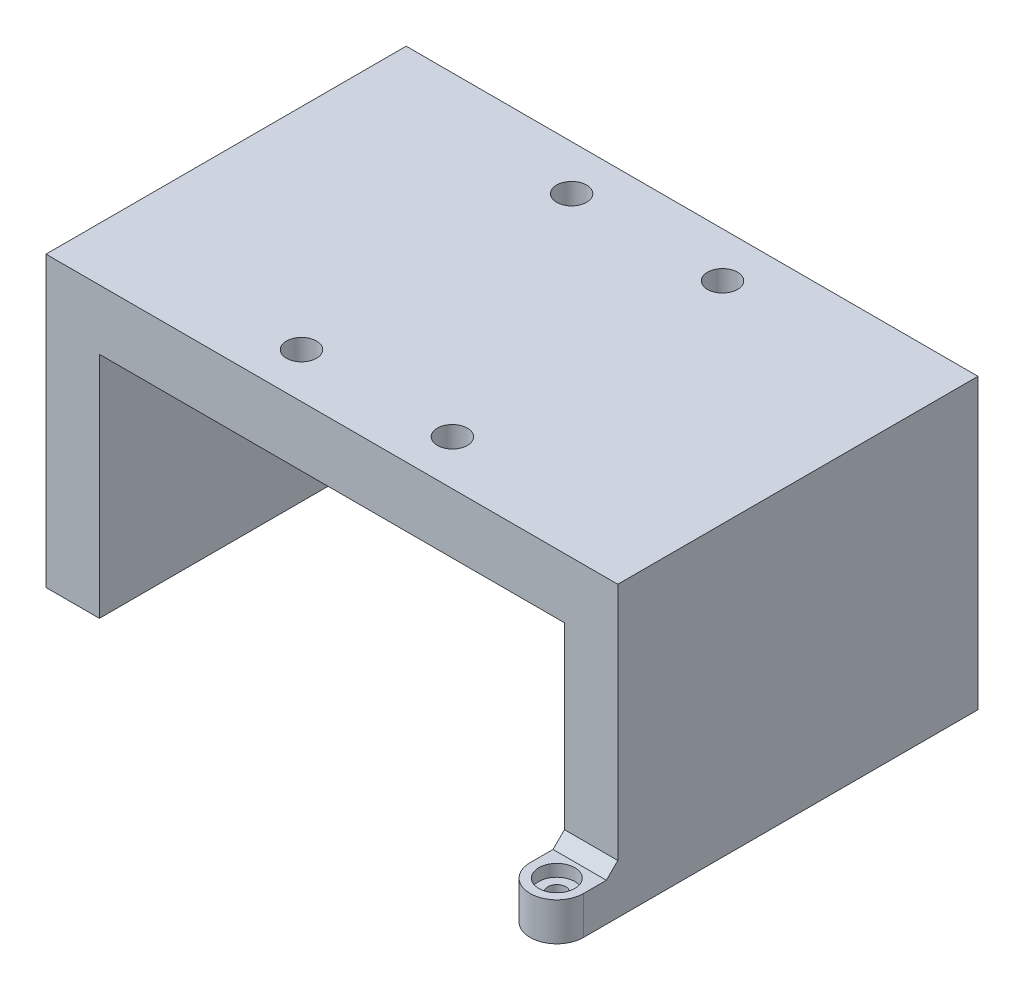
ISO-10303-21;
HEADER;
FILE_DESCRIPTION(('STEP AP214'),'2;1');
FILE_NAME('part.step','',(''),(''),'','','');
FILE_SCHEMA(('AUTOMOTIVE_DESIGN { 1 0 10303 214 1 1 1 1 }'));
ENDSEC;
DATA;
#1=APPLICATION_CONTEXT('core data for automotive mechanical design processes');
#2=APPLICATION_PROTOCOL_DEFINITION('international standard','automotive_design',2000,#1);
#3=PRODUCT_CONTEXT('',#1,'mechanical');
#4=PRODUCT('Part','Part','',(#3));
#5=PRODUCT_RELATED_PRODUCT_CATEGORY('part','',(#4));
#6=PRODUCT_DEFINITION_FORMATION('','',#4);
#7=PRODUCT_DEFINITION_CONTEXT('part definition',#1,'design');
#8=PRODUCT_DEFINITION('design','',#6,#7);
#9=PRODUCT_DEFINITION_SHAPE('','',#8);
#10=(LENGTH_UNIT() NAMED_UNIT(*) SI_UNIT(.MILLI.,.METRE.));
#11=(NAMED_UNIT(*) PLANE_ANGLE_UNIT() SI_UNIT($,.RADIAN.));
#12=(NAMED_UNIT(*) SI_UNIT($,.STERADIAN.) SOLID_ANGLE_UNIT());
#13=UNCERTAINTY_MEASURE_WITH_UNIT(LENGTH_MEASURE(1.E-05),#10,'distance_accuracy_value','');
#14=(GEOMETRIC_REPRESENTATION_CONTEXT(3) GLOBAL_UNCERTAINTY_ASSIGNED_CONTEXT((#13)) GLOBAL_UNIT_ASSIGNED_CONTEXT((#10,
#11,#12)) REPRESENTATION_CONTEXT('',''));
#15=CARTESIAN_POINT('',(0.,0.,0.));
#16=DIRECTION('',(0.,0.,1.));
#17=DIRECTION('',(1.,0.,0.));
#18=AXIS2_PLACEMENT_3D('',#15,#16,#17);
#19=CARTESIAN_POINT('',(-53.34,-31.75,0.));
#20=DIRECTION('',(0.,-1.,0.));
#21=DIRECTION('',(0.,0.,-1.));
#22=AXIS2_PLACEMENT_3D('',#19,#20,#21);
#23=CYLINDRICAL_SURFACE('',#22,1.5);
#24=CARTESIAN_POINT('',(-53.34,-38.1,0.));
#25=DIRECTION('',(0.,-1.,0.));
#26=DIRECTION('',(0.,0.,-1.));
#27=AXIS2_PLACEMENT_3D('',#24,#25,#26);
#28=CIRCLE('',#27,1.5);
#29=CARTESIAN_POINT('',(-53.34,-38.1,-1.50000000000002));
#30=VERTEX_POINT('',#29);
#31=EDGE_CURVE('E185',#30,#30,#28,.T.);
#32=ORIENTED_EDGE('',*,*,#31,.T.);
#33=EDGE_LOOP('',(#32));
#34=FACE_BOUND('',#33,.T.);
#35=CARTESIAN_POINT('',(-53.34,-33.74898,0.));
#36=DIRECTION('',(0.,1.,0.));
#37=DIRECTION('',(0.,0.,1.));
#38=AXIS2_PLACEMENT_3D('',#35,#36,#37);
#39=CIRCLE('',#38,1.5);
#40=CARTESIAN_POINT('',(-53.34,-33.74898,1.49999999999999));
#41=VERTEX_POINT('',#40);
#42=EDGE_CURVE('E175',#41,#41,#39,.F.);
#43=ORIENTED_EDGE('',*,*,#42,.F.);
#44=EDGE_LOOP('',(#43));
#45=FACE_BOUND('',#44,.T.);
#46=ADVANCED_FACE('F41',(#34,#45),#23,.F.);
#47=CARTESIAN_POINT('',(43.18,-31.75,35.715));
#48=DIRECTION('',(0.,-1.,0.));
#49=DIRECTION('',(0.,0.,-1.));
#50=AXIS2_PLACEMENT_3D('',#47,#48,#49);
#51=CYLINDRICAL_SURFACE('',#50,1.500000048);
#52=CARTESIAN_POINT('',(43.18,-38.1,35.715));
#53=DIRECTION('',(0.,-1.,0.));
#54=DIRECTION('',(0.,0.,-1.));
#55=AXIS2_PLACEMENT_3D('',#52,#53,#54);
#56=CIRCLE('',#55,1.500000048);
#57=CARTESIAN_POINT('',(43.18,-38.1,34.214999952));
#58=VERTEX_POINT('',#57);
#59=EDGE_CURVE('E181',#58,#58,#56,.T.);
#60=ORIENTED_EDGE('',*,*,#59,.T.);
#61=EDGE_LOOP('',(#60));
#62=FACE_BOUND('',#61,.T.);
#63=CARTESIAN_POINT('',(43.18,-33.74898,35.715));
#64=DIRECTION('',(0.,1.,0.));
#65=DIRECTION('',(0.,0.,1.));
#66=AXIS2_PLACEMENT_3D('',#63,#64,#65);
#67=CIRCLE('',#66,1.500000048);
#68=CARTESIAN_POINT('',(43.18,-33.74898,37.215000048));
#69=VERTEX_POINT('',#68);
#70=EDGE_CURVE('E296',#69,#69,#67,.F.);
#71=ORIENTED_EDGE('',*,*,#70,.F.);
#72=EDGE_LOOP('',(#71));
#73=FACE_BOUND('',#72,.T.);
#74=ADVANCED_FACE('F404',(#62,#73),#51,.F.);
#75=CARTESIAN_POINT('',(-47.625,9.99998,30.));
#76=DIRECTION('',(1.,0.,0.));
#77=DIRECTION('',(0.,0.,-1.));
#78=AXIS2_PLACEMENT_3D('',#75,#76,#77);
#79=PLANE('',#78);
#80=DIRECTION('',(0.,0.,1.));
#81=VECTOR('',#80,1.);
#82=CARTESIAN_POINT('',(-47.625,-29.845,30.));
#83=LINE('',#82,#81);
#84=CARTESIAN_POINT('',(-47.625,-29.845,-4.44500000000001));
#85=VERTEX_POINT('',#84);
#86=CARTESIAN_POINT('',(-47.625,-29.845,4.44499999999999));
#87=VERTEX_POINT('',#86);
#88=EDGE_CURVE('E295',#85,#87,#83,.T.);
#89=ORIENTED_EDGE('',*,*,#88,.T.);
#90=DIRECTION('',(0.,-1.,0.));
#91=VECTOR('',#90,1.);
#92=CARTESIAN_POINT('',(-47.625,-31.75,4.44499999999999));
#93=LINE('',#92,#91);
#94=CARTESIAN_POINT('',(-47.625,-38.1,4.44499999999999));
#95=VERTEX_POINT('',#94);
#96=EDGE_CURVE('E205',#87,#95,#93,.T.);
#97=ORIENTED_EDGE('',*,*,#96,.T.);
#98=DIRECTION('',(0.,0.,-1.));
#99=VECTOR('',#98,1.);
#100=CARTESIAN_POINT('',(-47.625,-38.1,30.));
#101=LINE('',#100,#99);
#102=CARTESIAN_POINT('',(-47.625,-38.1,30.));
#103=VERTEX_POINT('',#102);
#104=EDGE_CURVE('E229',#103,#95,#101,.T.);
#105=ORIENTED_EDGE('',*,*,#104,.F.);
#106=DIRECTION('',(0.,-1.,0.));
#107=VECTOR('',#106,1.);
#108=CARTESIAN_POINT('',(-47.625,9.99998,30.));
#109=LINE('',#108,#107);
#110=CARTESIAN_POINT('',(-47.625,9.99998,30.));
#111=VERTEX_POINT('',#110);
#112=EDGE_CURVE('E288',#111,#103,#109,.T.);
#113=ORIENTED_EDGE('',*,*,#112,.F.);
#114=DIRECTION('',(0.,0.,1.));
#115=VECTOR('',#114,1.);
#116=CARTESIAN_POINT('',(-47.625,9.99998,30.));
#117=LINE('',#116,#115);
#118=CARTESIAN_POINT('',(-47.625,9.99998,-30.));
#119=VERTEX_POINT('',#118);
#120=EDGE_CURVE('E279',#119,#111,#117,.T.);
#121=ORIENTED_EDGE('',*,*,#120,.F.);
#122=DIRECTION('',(0.,-1.,0.));
#123=VECTOR('',#122,1.);
#124=CARTESIAN_POINT('',(-47.625,9.99998,-30.));
#125=LINE('',#124,#123);
#126=CARTESIAN_POINT('',(-47.625,-38.1,-30.));
#127=VERTEX_POINT('',#126);
#128=EDGE_CURVE('E290',#119,#127,#125,.T.);
#129=ORIENTED_EDGE('',*,*,#128,.T.);
#130=CARTESIAN_POINT('',(-47.625,-38.1,-4.44500000000001));
#131=VERTEX_POINT('',#130);
#132=EDGE_CURVE('E233',#131,#127,#101,.T.);
#133=ORIENTED_EDGE('',*,*,#132,.F.);
#134=DIRECTION('',(0.,-1.,0.));
#135=VECTOR('',#134,1.);
#136=CARTESIAN_POINT('',(-47.625,-31.75,-4.44500000000001));
#137=LINE('',#136,#135);
#138=EDGE_CURVE('E213',#85,#131,#137,.T.);
#139=ORIENTED_EDGE('',*,*,#138,.F.);
#140=EDGE_LOOP('',(#89,#97,#105,#113,#121,#129,#133,#139));
#141=FACE_BOUND('',#140,.T.);
#142=ADVANCED_FACE('F325',(#141),#79,.F.);
#143=CARTESIAN_POINT('',(0.,0.,0.));
#144=DIRECTION('',(0.,-1.,0.));
#145=DIRECTION('',(0.,0.,-1.));
#146=AXIS2_PLACEMENT_3D('',#143,#144,#145);
#147=PLANE('',#146);
#148=CARTESIAN_POINT('',(12.57,0.,-22.5));
#149=DIRECTION('',(0.,1.,0.));
#150=DIRECTION('',(0.,0.,1.));
#151=AXIS2_PLACEMENT_3D('',#148,#149,#150);
#152=CIRCLE('',#151,2.5);
#153=CARTESIAN_POINT('',(12.57,0.,-20.));
#154=VERTEX_POINT('',#153);
#155=EDGE_CURVE('E252',#154,#154,#152,.T.);
#156=ORIENTED_EDGE('',*,*,#155,.T.);
#157=EDGE_LOOP('',(#156));
#158=FACE_BOUND('',#157,.T.);
#159=CARTESIAN_POINT('',(-12.57,0.,-22.5));
#160=DIRECTION('',(0.,1.,0.));
#161=DIRECTION('',(0.,0.,1.));
#162=AXIS2_PLACEMENT_3D('',#159,#160,#161);
#163=CIRCLE('',#162,2.5);
#164=CARTESIAN_POINT('',(-12.57,0.,-20.));
#165=VERTEX_POINT('',#164);
#166=EDGE_CURVE('E264',#165,#165,#163,.T.);
#167=ORIENTED_EDGE('',*,*,#166,.T.);
#168=EDGE_LOOP('',(#167));
#169=FACE_BOUND('',#168,.T.);
#170=CARTESIAN_POINT('',(12.57,0.,22.5));
#171=DIRECTION('',(0.,1.,0.));
#172=DIRECTION('',(0.,0.,1.));
#173=AXIS2_PLACEMENT_3D('',#170,#171,#172);
#174=CIRCLE('',#173,2.5);
#175=CARTESIAN_POINT('',(12.57,0.,25.));
#176=VERTEX_POINT('',#175);
#177=EDGE_CURVE('E258',#176,#176,#174,.T.);
#178=ORIENTED_EDGE('',*,*,#177,.T.);
#179=EDGE_LOOP('',(#178));
#180=FACE_BOUND('',#179,.T.);
#181=CARTESIAN_POINT('',(-12.57,0.,22.5));
#182=DIRECTION('',(0.,1.,0.));
#183=DIRECTION('',(0.,0.,1.));
#184=AXIS2_PLACEMENT_3D('',#181,#182,#183);
#185=CIRCLE('',#184,2.5);
#186=CARTESIAN_POINT('',(-12.57,0.,25.));
#187=VERTEX_POINT('',#186);
#188=EDGE_CURVE('E248',#187,#187,#185,.T.);
#189=ORIENTED_EDGE('',*,*,#188,.T.);
#190=EDGE_LOOP('',(#189));
#191=FACE_BOUND('',#190,.T.);
#192=DIRECTION('',(-1.,0.,0.));
#193=VECTOR('',#192,1.);
#194=CARTESIAN_POINT('',(-47.625,0.,-30.));
#195=LINE('',#194,#193);
#196=CARTESIAN_POINT('',(38.735,0.,-30.));
#197=VERTEX_POINT('',#196);
#198=CARTESIAN_POINT('',(-38.735,0.,-30.));
#199=VERTEX_POINT('',#198);
#200=EDGE_CURVE('E270',#197,#199,#195,.T.);
#201=ORIENTED_EDGE('',*,*,#200,.F.);
#202=DIRECTION('',(0.,0.,-1.));
#203=VECTOR('',#202,1.);
#204=CARTESIAN_POINT('',(38.735,0.,30.));
#205=LINE('',#204,#203);
#206=CARTESIAN_POINT('',(38.735,0.,30.));
#207=VERTEX_POINT('',#206);
#208=EDGE_CURVE('E224',#207,#197,#205,.T.);
#209=ORIENTED_EDGE('',*,*,#208,.F.);
#210=DIRECTION('',(1.,0.,0.));
#211=VECTOR('',#210,1.);
#212=CARTESIAN_POINT('',(-47.625,0.,30.));
#213=LINE('',#212,#211);
#214=CARTESIAN_POINT('',(-38.735,0.,30.));
#215=VERTEX_POINT('',#214);
#216=EDGE_CURVE('E277',#215,#207,#213,.T.);
#217=ORIENTED_EDGE('',*,*,#216,.F.);
#218=DIRECTION('',(0.,0.,1.));
#219=VECTOR('',#218,1.);
#220=CARTESIAN_POINT('',(-38.735,0.,30.));
#221=LINE('',#220,#219);
#222=EDGE_CURVE('E226',#199,#215,#221,.T.);
#223=ORIENTED_EDGE('',*,*,#222,.F.);
#224=EDGE_LOOP('',(#201,#209,#217,#223));
#225=FACE_BOUND('',#224,.T.);
#226=ADVANCED_FACE('F368',(#158,#169,#180,#191,#225),#147,.T.);
#227=CARTESIAN_POINT('',(0.,9.99998,0.));
#228=DIRECTION('',(0.,-1.,0.));
#229=DIRECTION('',(0.,0.,-1.));
#230=AXIS2_PLACEMENT_3D('',#227,#228,#229);
#231=PLANE('',#230);
#232=DIRECTION('',(0.,0.,-1.));
#233=VECTOR('',#232,1.);
#234=CARTESIAN_POINT('',(47.625,9.99998,30.));
#235=LINE('',#234,#233);
#236=CARTESIAN_POINT('',(47.625,9.99998,30.));
#237=VERTEX_POINT('',#236);
#238=CARTESIAN_POINT('',(47.625,9.99998,-30.));
#239=VERTEX_POINT('',#238);
#240=EDGE_CURVE('E273',#237,#239,#235,.T.);
#241=ORIENTED_EDGE('',*,*,#240,.T.);
#242=DIRECTION('',(-1.,0.,0.));
#243=VECTOR('',#242,1.);
#244=CARTESIAN_POINT('',(-47.625,9.99998,-30.));
#245=LINE('',#244,#243);
#246=EDGE_CURVE('E276',#239,#119,#245,.T.);
#247=ORIENTED_EDGE('',*,*,#246,.T.);
#248=ORIENTED_EDGE('',*,*,#120,.T.);
#249=DIRECTION('',(1.,0.,0.));
#250=VECTOR('',#249,1.);
#251=CARTESIAN_POINT('',(-47.625,9.99998,30.));
#252=LINE('',#251,#250);
#253=EDGE_CURVE('E281',#111,#237,#252,.T.);
#254=ORIENTED_EDGE('',*,*,#253,.T.);
#255=EDGE_LOOP('',(#241,#247,#248,#254));
#256=FACE_BOUND('',#255,.T.);
#257=CARTESIAN_POINT('',(-12.57,9.99998,-22.5));
#258=DIRECTION('',(0.,1.,0.));
#259=DIRECTION('',(0.,0.,1.));
#260=AXIS2_PLACEMENT_3D('',#257,#258,#259);
#261=CIRCLE('',#260,2.5);
#262=CARTESIAN_POINT('',(-12.57,9.99998,-20.));
#263=VERTEX_POINT('',#262);
#264=EDGE_CURVE('E267',#263,#263,#261,.T.);
#265=ORIENTED_EDGE('',*,*,#264,.F.);
#266=EDGE_LOOP('',(#265));
#267=FACE_BOUND('',#266,.T.);
#268=CARTESIAN_POINT('',(12.57,9.99998,22.5));
#269=DIRECTION('',(0.,1.,0.));
#270=DIRECTION('',(0.,0.,1.));
#271=AXIS2_PLACEMENT_3D('',#268,#269,#270);
#272=CIRCLE('',#271,2.5);
#273=CARTESIAN_POINT('',(12.57,9.99998,25.));
#274=VERTEX_POINT('',#273);
#275=EDGE_CURVE('E261',#274,#274,#272,.T.);
#276=ORIENTED_EDGE('',*,*,#275,.F.);
#277=EDGE_LOOP('',(#276));
#278=FACE_BOUND('',#277,.T.);
#279=CARTESIAN_POINT('',(12.57,9.99998,-22.5));
#280=DIRECTION('',(0.,1.,0.));
#281=DIRECTION('',(0.,0.,1.));
#282=AXIS2_PLACEMENT_3D('',#279,#280,#281);
#283=CIRCLE('',#282,2.5);
#284=CARTESIAN_POINT('',(12.57,9.99998,-20.));
#285=VERTEX_POINT('',#284);
#286=EDGE_CURVE('E255',#285,#285,#283,.T.);
#287=ORIENTED_EDGE('',*,*,#286,.F.);
#288=EDGE_LOOP('',(#287));
#289=FACE_BOUND('',#288,.T.);
#290=CARTESIAN_POINT('',(-12.57,9.99998,22.5));
#291=DIRECTION('',(0.,1.,0.));
#292=DIRECTION('',(0.,0.,1.));
#293=AXIS2_PLACEMENT_3D('',#290,#291,#292);
#294=CIRCLE('',#293,2.5);
#295=CARTESIAN_POINT('',(-12.57,9.99998,25.));
#296=VERTEX_POINT('',#295);
#297=EDGE_CURVE('E249',#296,#296,#294,.T.);
#298=ORIENTED_EDGE('',*,*,#297,.F.);
#299=EDGE_LOOP('',(#298));
#300=FACE_BOUND('',#299,.T.);
#301=ADVANCED_FACE('F354',(#256,#267,#278,#289,#300),#231,.F.);
#302=CARTESIAN_POINT('',(47.625,9.99998,30.));
#303=DIRECTION('',(-1.,0.,0.));
#304=DIRECTION('',(0.,0.,1.));
#305=AXIS2_PLACEMENT_3D('',#302,#303,#304);
#306=PLANE('',#305);
#307=DIRECTION('',(0.,-1.,0.));
#308=VECTOR('',#307,1.);
#309=CARTESIAN_POINT('',(47.625,9.99998,30.));
#310=LINE('',#309,#308);
#311=CARTESIAN_POINT('',(47.625,-29.845,30.));
#312=VERTEX_POINT('',#311);
#313=EDGE_CURVE('E283',#237,#312,#310,.T.);
#314=ORIENTED_EDGE('',*,*,#313,.T.);
#315=DIRECTION('',(0.,-0.70710678118655,0.707106781186545));
#316=VECTOR('',#315,1.);
#317=CARTESIAN_POINT('',(47.625,-9.92250999999987,10.07751));
#318=LINE('',#317,#316);
#319=CARTESIAN_POINT('',(47.625,-31.75,31.905));
#320=VERTEX_POINT('',#319);
#321=EDGE_CURVE('E50',#312,#320,#318,.T.);
#322=ORIENTED_EDGE('',*,*,#321,.T.);
#323=DIRECTION('',(0.,0.,1.));
#324=VECTOR('',#323,1.);
#325=CARTESIAN_POINT('',(47.625,-31.75,35.715));
#326=LINE('',#325,#324);
#327=CARTESIAN_POINT('',(47.625,-31.75,35.715));
#328=VERTEX_POINT('',#327);
#329=EDGE_CURVE('E182',#320,#328,#326,.T.);
#330=ORIENTED_EDGE('',*,*,#329,.T.);
#331=DIRECTION('',(0.,-1.,0.));
#332=VECTOR('',#331,1.);
#333=CARTESIAN_POINT('',(47.625,-31.75,35.715));
#334=LINE('',#333,#332);
#335=CARTESIAN_POINT('',(47.625,-38.1,35.715));
#336=VERTEX_POINT('',#335);
#337=EDGE_CURVE('E174',#328,#336,#334,.T.);
#338=ORIENTED_EDGE('',*,*,#337,.T.);
#339=DIRECTION('',(0.,0.,1.));
#340=VECTOR('',#339,1.);
#341=CARTESIAN_POINT('',(47.625,-38.1,30.));
#342=LINE('',#341,#340);
#343=CARTESIAN_POINT('',(47.625,-38.1,-30.));
#344=VERTEX_POINT('',#343);
#345=EDGE_CURVE('E164',#344,#336,#342,.T.);
#346=ORIENTED_EDGE('',*,*,#345,.F.);
#347=DIRECTION('',(0.,-1.,0.));
#348=VECTOR('',#347,1.);
#349=CARTESIAN_POINT('',(47.625,9.99998,-30.));
#350=LINE('',#349,#348);
#351=EDGE_CURVE('E293',#239,#344,#350,.T.);
#352=ORIENTED_EDGE('',*,*,#351,.F.);
#353=ORIENTED_EDGE('',*,*,#240,.F.);
#354=EDGE_LOOP('',(#314,#322,#330,#338,#346,#352,#353));
#355=FACE_BOUND('',#354,.T.);
#356=ADVANCED_FACE('F369',(#355),#306,.F.);
#357=CARTESIAN_POINT('',(-47.625,9.99998,-30.));
#358=DIRECTION('',(0.,0.,1.));
#359=DIRECTION('',(1.,0.,0.));
#360=AXIS2_PLACEMENT_3D('',#357,#358,#359);
#361=PLANE('',#360);
#362=ORIENTED_EDGE('',*,*,#351,.T.);
#363=DIRECTION('',(1.,0.,0.));
#364=VECTOR('',#363,1.);
#365=CARTESIAN_POINT('',(47.625,-38.1,-30.));
#366=LINE('',#365,#364);
#367=CARTESIAN_POINT('',(38.735,-38.1,-30.));
#368=VERTEX_POINT('',#367);
#369=EDGE_CURVE('E165',#368,#344,#366,.T.);
#370=ORIENTED_EDGE('',*,*,#369,.F.);
#371=DIRECTION('',(0.,1.,0.));
#372=VECTOR('',#371,1.);
#373=CARTESIAN_POINT('',(38.735,-38.1,-30.));
#374=LINE('',#373,#372);
#375=EDGE_CURVE('E159',#368,#197,#374,.T.);
#376=ORIENTED_EDGE('',*,*,#375,.T.);
#377=ORIENTED_EDGE('',*,*,#200,.T.);
#378=DIRECTION('',(0.,1.,0.));
#379=VECTOR('',#378,1.);
#380=CARTESIAN_POINT('',(-38.735,-38.1,-30.));
#381=LINE('',#380,#379);
#382=CARTESIAN_POINT('',(-38.735,-38.1,-30.));
#383=VERTEX_POINT('',#382);
#384=EDGE_CURVE('E245',#383,#199,#381,.T.);
#385=ORIENTED_EDGE('',*,*,#384,.F.);
#386=DIRECTION('',(1.,0.,0.));
#387=VECTOR('',#386,1.);
#388=CARTESIAN_POINT('',(-47.625,-38.1,-30.));
#389=LINE('',#388,#387);
#390=EDGE_CURVE('E232',#127,#383,#389,.T.);
#391=ORIENTED_EDGE('',*,*,#390,.F.);
#392=ORIENTED_EDGE('',*,*,#128,.F.);
#393=ORIENTED_EDGE('',*,*,#246,.F.);
#394=EDGE_LOOP('',(#362,#370,#376,#377,#385,#391,#392,#393));
#395=FACE_BOUND('',#394,.T.);
#396=ADVANCED_FACE('F358',(#395),#361,.F.);
#397=CARTESIAN_POINT('',(-47.625,9.99998,30.));
#398=DIRECTION('',(0.,0.,-1.));
#399=DIRECTION('',(-1.,0.,0.));
#400=AXIS2_PLACEMENT_3D('',#397,#398,#399);
#401=PLANE('',#400);
#402=DIRECTION('',(0.,1.,0.));
#403=VECTOR('',#402,1.);
#404=CARTESIAN_POINT('',(38.735,-38.1,30.));
#405=LINE('',#404,#403);
#406=CARTESIAN_POINT('',(38.735,-29.845,30.));
#407=VERTEX_POINT('',#406);
#408=EDGE_CURVE('E215',#407,#207,#405,.T.);
#409=ORIENTED_EDGE('',*,*,#408,.F.);
#410=DIRECTION('',(1.,0.,0.));
#411=VECTOR('',#410,1.);
#412=CARTESIAN_POINT('',(-47.625,-29.845,30.));
#413=LINE('',#412,#411);
#414=EDGE_CURVE('E306',#407,#312,#413,.T.);
#415=ORIENTED_EDGE('',*,*,#414,.T.);
#416=ORIENTED_EDGE('',*,*,#313,.F.);
#417=ORIENTED_EDGE('',*,*,#253,.F.);
#418=ORIENTED_EDGE('',*,*,#112,.T.);
#419=DIRECTION('',(-1.,0.,0.));
#420=VECTOR('',#419,1.);
#421=CARTESIAN_POINT('',(-47.625,-38.1,30.));
#422=LINE('',#421,#420);
#423=CARTESIAN_POINT('',(-38.735,-38.1,30.));
#424=VERTEX_POINT('',#423);
#425=EDGE_CURVE('E237',#424,#103,#422,.T.);
#426=ORIENTED_EDGE('',*,*,#425,.F.);
#427=DIRECTION('',(0.,1.,0.));
#428=VECTOR('',#427,1.);
#429=CARTESIAN_POINT('',(-38.735,-38.1,30.));
#430=LINE('',#429,#428);
#431=EDGE_CURVE('E240',#424,#215,#430,.T.);
#432=ORIENTED_EDGE('',*,*,#431,.T.);
#433=ORIENTED_EDGE('',*,*,#216,.T.);
#434=EDGE_LOOP('',(#409,#415,#416,#417,#418,#426,#432,#433));
#435=FACE_BOUND('',#434,.T.);
#436=ADVANCED_FACE('F351',(#435),#401,.F.);
#437=CARTESIAN_POINT('',(-12.57,9.99998,-22.5));
#438=DIRECTION('',(0.,-1.,0.));
#439=DIRECTION('',(0.,0.,-1.));
#440=AXIS2_PLACEMENT_3D('',#437,#438,#439);
#441=CYLINDRICAL_SURFACE('',#440,2.5);
#442=ORIENTED_EDGE('',*,*,#264,.T.);
#443=EDGE_LOOP('',(#442));
#444=FACE_BOUND('',#443,.T.);
#445=ORIENTED_EDGE('',*,*,#166,.F.);
#446=EDGE_LOOP('',(#445));
#447=FACE_BOUND('',#446,.T.);
#448=ADVANCED_FACE('F443',(#444,#447),#441,.F.);
#449=CARTESIAN_POINT('',(12.57,9.99998,22.5));
#450=DIRECTION('',(0.,-1.,0.));
#451=DIRECTION('',(0.,0.,-1.));
#452=AXIS2_PLACEMENT_3D('',#449,#450,#451);
#453=CYLINDRICAL_SURFACE('',#452,2.5);
#454=ORIENTED_EDGE('',*,*,#275,.T.);
#455=EDGE_LOOP('',(#454));
#456=FACE_BOUND('',#455,.T.);
#457=ORIENTED_EDGE('',*,*,#177,.F.);
#458=EDGE_LOOP('',(#457));
#459=FACE_BOUND('',#458,.T.);
#460=ADVANCED_FACE('F439',(#456,#459),#453,.F.);
#461=CARTESIAN_POINT('',(12.57,9.99998,-22.5));
#462=DIRECTION('',(0.,-1.,0.));
#463=DIRECTION('',(0.,0.,-1.));
#464=AXIS2_PLACEMENT_3D('',#461,#462,#463);
#465=CYLINDRICAL_SURFACE('',#464,2.5);
#466=ORIENTED_EDGE('',*,*,#286,.T.);
#467=EDGE_LOOP('',(#466));
#468=FACE_BOUND('',#467,.T.);
#469=ORIENTED_EDGE('',*,*,#155,.F.);
#470=EDGE_LOOP('',(#469));
#471=FACE_BOUND('',#470,.T.);
#472=ADVANCED_FACE('F435',(#468,#471),#465,.F.);
#473=CARTESIAN_POINT('',(-12.57,9.99998,22.5));
#474=DIRECTION('',(0.,-1.,0.));
#475=DIRECTION('',(0.,0.,-1.));
#476=AXIS2_PLACEMENT_3D('',#473,#474,#475);
#477=CYLINDRICAL_SURFACE('',#476,2.5);
#478=ORIENTED_EDGE('',*,*,#297,.T.);
#479=EDGE_LOOP('',(#478));
#480=FACE_BOUND('',#479,.T.);
#481=ORIENTED_EDGE('',*,*,#188,.F.);
#482=EDGE_LOOP('',(#481));
#483=FACE_BOUND('',#482,.T.);
#484=ADVANCED_FACE('F432',(#480,#483),#477,.F.);
#485=CARTESIAN_POINT('',(-38.735,-38.1,30.));
#486=DIRECTION('',(-1.,0.,0.));
#487=DIRECTION('',(0.,0.,1.));
#488=AXIS2_PLACEMENT_3D('',#485,#486,#487);
#489=PLANE('',#488);
#490=ORIENTED_EDGE('',*,*,#222,.T.);
#491=ORIENTED_EDGE('',*,*,#431,.F.);
#492=DIRECTION('',(0.,0.,1.));
#493=VECTOR('',#492,1.);
#494=CARTESIAN_POINT('',(-38.735,-38.1,30.));
#495=LINE('',#494,#493);
#496=EDGE_CURVE('E235',#383,#424,#495,.T.);
#497=ORIENTED_EDGE('',*,*,#496,.F.);
#498=ORIENTED_EDGE('',*,*,#384,.T.);
#499=EDGE_LOOP('',(#490,#491,#497,#498));
#500=FACE_BOUND('',#499,.T.);
#501=ADVANCED_FACE('F364',(#500),#489,.F.);
#502=CARTESIAN_POINT('',(0.,-38.1,0.));
#503=DIRECTION('',(0.,-1.,0.));
#504=DIRECTION('',(0.,0.,-1.));
#505=AXIS2_PLACEMENT_3D('',#502,#503,#504);
#506=PLANE('',#505);
#507=ORIENTED_EDGE('',*,*,#104,.T.);
#508=DIRECTION('',(-1.,0.,0.));
#509=VECTOR('',#508,1.);
#510=CARTESIAN_POINT('',(-53.34,-38.1,4.44499999999999));
#511=LINE('',#510,#509);
#512=CARTESIAN_POINT('',(-53.34,-38.1,4.44499999999999));
#513=VERTEX_POINT('',#512);
#514=EDGE_CURVE('E195',#95,#513,#511,.T.);
#515=ORIENTED_EDGE('',*,*,#514,.T.);
#516=CARTESIAN_POINT('',(-53.34,-38.1,0.));
#517=DIRECTION('',(0.,-1.,0.));
#518=DIRECTION('',(0.,0.,1.));
#519=AXIS2_PLACEMENT_3D('',#516,#517,#518);
#520=CIRCLE('',#519,4.445);
#521=CARTESIAN_POINT('',(-53.34,-38.1,-4.44500000000001));
#522=VERTEX_POINT('',#521);
#523=EDGE_CURVE('E208',#513,#522,#520,.T.);
#524=ORIENTED_EDGE('',*,*,#523,.T.);
#525=DIRECTION('',(1.,0.,0.));
#526=VECTOR('',#525,1.);
#527=CARTESIAN_POINT('',(-47.625,-38.1,-4.44500000000001));
#528=LINE('',#527,#526);
#529=EDGE_CURVE('E199',#522,#131,#528,.T.);
#530=ORIENTED_EDGE('',*,*,#529,.T.);
#531=ORIENTED_EDGE('',*,*,#132,.T.);
#532=ORIENTED_EDGE('',*,*,#390,.T.);
#533=ORIENTED_EDGE('',*,*,#496,.T.);
#534=ORIENTED_EDGE('',*,*,#425,.T.);
#535=EDGE_LOOP('',(#507,#515,#524,#530,#531,#532,#533,#534));
#536=FACE_BOUND('',#535,.T.);
#537=ORIENTED_EDGE('',*,*,#31,.F.);
#538=EDGE_LOOP('',(#537));
#539=FACE_BOUND('',#538,.T.);
#540=ADVANCED_FACE('F332',(#536,#539),#506,.T.);
#541=CARTESIAN_POINT('',(38.735,-38.1,30.));
#542=DIRECTION('',(1.,0.,0.));
#543=DIRECTION('',(0.,0.,-1.));
#544=AXIS2_PLACEMENT_3D('',#541,#542,#543);
#545=PLANE('',#544);
#546=ORIENTED_EDGE('',*,*,#208,.T.);
#547=ORIENTED_EDGE('',*,*,#375,.F.);
#548=DIRECTION('',(0.,0.,-1.));
#549=VECTOR('',#548,1.);
#550=CARTESIAN_POINT('',(38.735,-38.1,30.));
#551=LINE('',#550,#549);
#552=CARTESIAN_POINT('',(38.735,-38.1,35.715));
#553=VERTEX_POINT('',#552);
#554=EDGE_CURVE('E153',#553,#368,#551,.T.);
#555=ORIENTED_EDGE('',*,*,#554,.F.);
#556=DIRECTION('',(0.,-1.,0.));
#557=VECTOR('',#556,1.);
#558=CARTESIAN_POINT('',(38.735,-31.75,35.715));
#559=LINE('',#558,#557);
#560=CARTESIAN_POINT('',(38.735,-31.75,35.715));
#561=VERTEX_POINT('',#560);
#562=EDGE_CURVE('E156',#561,#553,#559,.T.);
#563=ORIENTED_EDGE('',*,*,#562,.F.);
#564=DIRECTION('',(0.,0.,-1.));
#565=VECTOR('',#564,1.);
#566=CARTESIAN_POINT('',(38.735,-31.75,30.));
#567=LINE('',#566,#565);
#568=CARTESIAN_POINT('',(38.735,-31.75,31.905));
#569=VERTEX_POINT('',#568);
#570=EDGE_CURVE('E190',#561,#569,#567,.T.);
#571=ORIENTED_EDGE('',*,*,#570,.T.);
#572=DIRECTION('',(0.,0.70710678118655,-0.707106781186545));
#573=VECTOR('',#572,1.);
#574=CARTESIAN_POINT('',(38.735,-33.9725,34.1275));
#575=LINE('',#574,#573);
#576=EDGE_CURVE('E11',#569,#407,#575,.T.);
#577=ORIENTED_EDGE('',*,*,#576,.T.);
#578=ORIENTED_EDGE('',*,*,#408,.T.);
#579=EDGE_LOOP('',(#546,#547,#555,#563,#571,#577,#578));
#580=FACE_BOUND('',#579,.T.);
#581=ADVANCED_FACE('F155',(#580),#545,.F.);
#582=CARTESIAN_POINT('',(0.,-38.1,0.));
#583=DIRECTION('',(0.,1.,0.));
#584=DIRECTION('',(0.,0.,1.));
#585=AXIS2_PLACEMENT_3D('',#582,#583,#584);
#586=PLANE('',#585);
#587=ORIENTED_EDGE('',*,*,#345,.T.);
#588=CARTESIAN_POINT('',(43.18,-38.1,35.715));
#589=DIRECTION('',(0.,-1.,0.));
#590=DIRECTION('',(0.,0.,1.));
#591=AXIS2_PLACEMENT_3D('',#588,#589,#590);
#592=CIRCLE('',#591,4.445);
#593=EDGE_CURVE('E171',#336,#553,#592,.T.);
#594=ORIENTED_EDGE('',*,*,#593,.T.);
#595=ORIENTED_EDGE('',*,*,#554,.T.);
#596=ORIENTED_EDGE('',*,*,#369,.T.);
#597=EDGE_LOOP('',(#587,#594,#595,#596));
#598=FACE_BOUND('',#597,.T.);
#599=ORIENTED_EDGE('',*,*,#59,.F.);
#600=EDGE_LOOP('',(#599));
#601=FACE_BOUND('',#600,.T.);
#602=ADVANCED_FACE('F177',(#598,#601),#586,.F.);
#603=CARTESIAN_POINT('',(-47.625,-31.75,-4.44500000000001));
#604=DIRECTION('',(0.,0.,-1.));
#605=DIRECTION('',(-1.,0.,0.));
#606=AXIS2_PLACEMENT_3D('',#603,#604,#605);
#607=PLANE('',#606);
#608=ORIENTED_EDGE('',*,*,#529,.F.);
#609=DIRECTION('',(0.,-1.,0.));
#610=VECTOR('',#609,1.);
#611=CARTESIAN_POINT('',(-53.34,-31.75,-4.44500000000001));
#612=LINE('',#611,#610);
#613=CARTESIAN_POINT('',(-53.34,-31.75,-4.44500000000001));
#614=VERTEX_POINT('',#613);
#615=EDGE_CURVE('E216',#614,#522,#612,.T.);
#616=ORIENTED_EDGE('',*,*,#615,.F.);
#617=DIRECTION('',(1.,0.,0.));
#618=VECTOR('',#617,1.);
#619=CARTESIAN_POINT('',(-47.625,-31.75,-4.44500000000001));
#620=LINE('',#619,#618);
#621=CARTESIAN_POINT('',(-49.53,-31.75,-4.44500000000001));
#622=VERTEX_POINT('',#621);
#623=EDGE_CURVE('E202',#614,#622,#620,.T.);
#624=ORIENTED_EDGE('',*,*,#623,.T.);
#625=DIRECTION('',(0.707106781186545,0.70710678118655,0.));
#626=VECTOR('',#625,1.);
#627=CARTESIAN_POINT('',(-47.625,-29.845,-4.44500000000001));
#628=LINE('',#627,#626);
#629=EDGE_CURVE('E312',#622,#85,#628,.T.);
#630=ORIENTED_EDGE('',*,*,#629,.T.);
#631=ORIENTED_EDGE('',*,*,#138,.T.);
#632=EDGE_LOOP('',(#608,#616,#624,#630,#631));
#633=FACE_BOUND('',#632,.T.);
#634=ADVANCED_FACE('F318',(#633),#607,.T.);
#635=CARTESIAN_POINT('',(-53.34,-31.75,0.));
#636=DIRECTION('',(0.,-1.,0.));
#637=DIRECTION('',(0.,0.,-1.));
#638=AXIS2_PLACEMENT_3D('',#635,#636,#637);
#639=CYLINDRICAL_SURFACE('',#638,4.445);
#640=ORIENTED_EDGE('',*,*,#523,.F.);
#641=DIRECTION('',(0.,-1.,0.));
#642=VECTOR('',#641,1.);
#643=CARTESIAN_POINT('',(-53.34,-31.75,4.44499999999999));
#644=LINE('',#643,#642);
#645=CARTESIAN_POINT('',(-53.34,-31.75,4.44499999999999));
#646=VERTEX_POINT('',#645);
#647=EDGE_CURVE('E218',#646,#513,#644,.T.);
#648=ORIENTED_EDGE('',*,*,#647,.F.);
#649=CARTESIAN_POINT('',(-53.34,-31.75,0.));
#650=DIRECTION('',(0.,-1.,0.));
#651=DIRECTION('',(0.,0.,1.));
#652=AXIS2_PLACEMENT_3D('',#649,#650,#651);
#653=CIRCLE('',#652,4.445);
#654=EDGE_CURVE('E198',#646,#614,#653,.T.);
#655=ORIENTED_EDGE('',*,*,#654,.T.);
#656=ORIENTED_EDGE('',*,*,#615,.T.);
#657=EDGE_LOOP('',(#640,#648,#655,#656));
#658=FACE_BOUND('',#657,.T.);
#659=ADVANCED_FACE('F339',(#658),#639,.T.);
#660=CARTESIAN_POINT('',(-53.34,-31.75,4.44499999999999));
#661=DIRECTION('',(0.,0.,1.));
#662=DIRECTION('',(1.,0.,0.));
#663=AXIS2_PLACEMENT_3D('',#660,#661,#662);
#664=PLANE('',#663);
#665=ORIENTED_EDGE('',*,*,#514,.F.);
#666=ORIENTED_EDGE('',*,*,#96,.F.);
#667=DIRECTION('',(-0.707106781186545,-0.70710678118655,0.));
#668=VECTOR('',#667,1.);
#669=CARTESIAN_POINT('',(-47.625,-29.845,4.44499999999999));
#670=LINE('',#669,#668);
#671=CARTESIAN_POINT('',(-49.53,-31.75,4.44499999999999));
#672=VERTEX_POINT('',#671);
#673=EDGE_CURVE('E310',#87,#672,#670,.T.);
#674=ORIENTED_EDGE('',*,*,#673,.T.);
#675=DIRECTION('',(-1.,0.,0.));
#676=VECTOR('',#675,1.);
#677=CARTESIAN_POINT('',(-53.34,-31.75,4.44499999999999));
#678=LINE('',#677,#676);
#679=EDGE_CURVE('E196',#672,#646,#678,.T.);
#680=ORIENTED_EDGE('',*,*,#679,.T.);
#681=ORIENTED_EDGE('',*,*,#647,.T.);
#682=EDGE_LOOP('',(#665,#666,#674,#680,#681));
#683=FACE_BOUND('',#682,.T.);
#684=ADVANCED_FACE('F344',(#683),#664,.T.);
#685=CARTESIAN_POINT('',(-53.34,-31.75,0.));
#686=DIRECTION('',(0.,1.,0.));
#687=DIRECTION('',(0.,0.,1.));
#688=AXIS2_PLACEMENT_3D('',#685,#686,#687);
#689=PLANE('',#688);
#690=CARTESIAN_POINT('',(-53.34,-31.75,0.));
#691=DIRECTION('',(0.,1.,0.));
#692=DIRECTION('',(0.,0.,1.));
#693=AXIS2_PLACEMENT_3D('',#690,#691,#692);
#694=CIRCLE('',#693,2.99974);
#695=CARTESIAN_POINT('',(-53.34,-31.75,2.99973999999999));
#696=VERTEX_POINT('',#695);
#697=EDGE_CURVE('E374',#696,#696,#694,.T.);
#698=ORIENTED_EDGE('',*,*,#697,.F.);
#699=EDGE_LOOP('',(#698));
#700=FACE_BOUND('',#699,.T.);
#701=ORIENTED_EDGE('',*,*,#679,.F.);
#702=DIRECTION('',(0.,0.,-1.));
#703=VECTOR('',#702,1.);
#704=CARTESIAN_POINT('',(-49.53,-31.75,0.));
#705=LINE('',#704,#703);
#706=EDGE_CURVE('E304',#672,#622,#705,.T.);
#707=ORIENTED_EDGE('',*,*,#706,.T.);
#708=ORIENTED_EDGE('',*,*,#623,.F.);
#709=ORIENTED_EDGE('',*,*,#654,.F.);
#710=EDGE_LOOP('',(#701,#707,#708,#709));
#711=FACE_BOUND('',#710,.T.);
#712=ADVANCED_FACE('F342',(#700,#711),#689,.T.);
#713=CARTESIAN_POINT('',(43.18,-31.75,35.715));
#714=DIRECTION('',(0.,-1.,0.));
#715=DIRECTION('',(0.,0.,-1.));
#716=AXIS2_PLACEMENT_3D('',#713,#714,#715);
#717=CYLINDRICAL_SURFACE('',#716,4.445);
#718=ORIENTED_EDGE('',*,*,#593,.F.);
#719=ORIENTED_EDGE('',*,*,#337,.F.);
#720=CARTESIAN_POINT('',(43.18,-31.75,35.715));
#721=DIRECTION('',(0.,-1.,0.));
#722=DIRECTION('',(0.,0.,1.));
#723=AXIS2_PLACEMENT_3D('',#720,#721,#722);
#724=CIRCLE('',#723,4.445);
#725=EDGE_CURVE('E173',#328,#561,#724,.T.);
#726=ORIENTED_EDGE('',*,*,#725,.T.);
#727=ORIENTED_EDGE('',*,*,#562,.T.);
#728=EDGE_LOOP('',(#718,#719,#726,#727));
#729=FACE_BOUND('',#728,.T.);
#730=ADVANCED_FACE('F169',(#729),#717,.T.);
#731=CARTESIAN_POINT('',(43.18,-31.75,35.715));
#732=DIRECTION('',(0.,1.,0.));
#733=DIRECTION('',(0.,0.,1.));
#734=AXIS2_PLACEMENT_3D('',#731,#732,#733);
#735=PLANE('',#734);
#736=CARTESIAN_POINT('',(43.18,-31.75,35.715));
#737=DIRECTION('',(0.,1.,0.));
#738=DIRECTION('',(0.,0.,1.));
#739=AXIS2_PLACEMENT_3D('',#736,#737,#738);
#740=CIRCLE('',#739,2.99973999999999);
#741=CARTESIAN_POINT('',(43.18,-31.75,38.71474));
#742=VERTEX_POINT('',#741);
#743=EDGE_CURVE('E377',#742,#742,#740,.T.);
#744=ORIENTED_EDGE('',*,*,#743,.F.);
#745=EDGE_LOOP('',(#744));
#746=FACE_BOUND('',#745,.T.);
#747=ORIENTED_EDGE('',*,*,#329,.F.);
#748=DIRECTION('',(-1.,0.,0.));
#749=VECTOR('',#748,1.);
#750=CARTESIAN_POINT('',(43.18,-31.75,31.905));
#751=LINE('',#750,#749);
#752=EDGE_CURVE('E63',#320,#569,#751,.T.);
#753=ORIENTED_EDGE('',*,*,#752,.T.);
#754=ORIENTED_EDGE('',*,*,#570,.F.);
#755=ORIENTED_EDGE('',*,*,#725,.F.);
#756=EDGE_LOOP('',(#747,#753,#754,#755));
#757=FACE_BOUND('',#756,.T.);
#758=ADVANCED_FACE('F393',(#746,#757),#735,.T.);
#759=CARTESIAN_POINT('',(43.18,-33.74898,35.715));
#760=DIRECTION('',(0.,1.,0.));
#761=DIRECTION('',(0.,0.,1.));
#762=AXIS2_PLACEMENT_3D('',#759,#760,#761);
#763=PLANE('',#762);
#764=CARTESIAN_POINT('',(43.18,-33.74898,35.715));
#765=DIRECTION('',(0.,1.,0.));
#766=DIRECTION('',(0.,0.,1.));
#767=AXIS2_PLACEMENT_3D('',#764,#765,#766);
#768=CIRCLE('',#767,2.99973999999999);
#769=CARTESIAN_POINT('',(43.18,-33.74898,38.71474));
#770=VERTEX_POINT('',#769);
#771=EDGE_CURVE('E299',#770,#770,#768,.T.);
#772=ORIENTED_EDGE('',*,*,#771,.T.);
#773=EDGE_LOOP('',(#772));
#774=FACE_BOUND('',#773,.T.);
#775=ORIENTED_EDGE('',*,*,#70,.T.);
#776=EDGE_LOOP('',(#775));
#777=FACE_BOUND('',#776,.T.);
#778=ADVANCED_FACE('F383',(#774,#777),#763,.T.);
#779=CARTESIAN_POINT('',(43.18,-33.74898,35.715));
#780=DIRECTION('',(0.,1.,0.));
#781=DIRECTION('',(0.,0.,1.));
#782=AXIS2_PLACEMENT_3D('',#779,#780,#781);
#783=CYLINDRICAL_SURFACE('',#782,2.99973999999999);
#784=ORIENTED_EDGE('',*,*,#771,.F.);
#785=EDGE_LOOP('',(#784));
#786=FACE_BOUND('',#785,.T.);
#787=ORIENTED_EDGE('',*,*,#743,.T.);
#788=EDGE_LOOP('',(#787));
#789=FACE_BOUND('',#788,.T.);
#790=ADVANCED_FACE('F386',(#786,#789),#783,.F.);
#791=CARTESIAN_POINT('',(-53.34,-33.74898,0.));
#792=DIRECTION('',(0.,1.,0.));
#793=DIRECTION('',(0.,0.,1.));
#794=AXIS2_PLACEMENT_3D('',#791,#792,#793);
#795=PLANE('',#794);
#796=CARTESIAN_POINT('',(-53.34,-33.74898,0.));
#797=DIRECTION('',(0.,1.,0.));
#798=DIRECTION('',(0.,0.,1.));
#799=AXIS2_PLACEMENT_3D('',#796,#797,#798);
#800=CIRCLE('',#799,2.99974);
#801=CARTESIAN_POINT('',(-53.34,-33.74898,2.99973999999999));
#802=VERTEX_POINT('',#801);
#803=EDGE_CURVE('E371',#802,#802,#800,.T.);
#804=ORIENTED_EDGE('',*,*,#803,.T.);
#805=EDGE_LOOP('',(#804));
#806=FACE_BOUND('',#805,.T.);
#807=ORIENTED_EDGE('',*,*,#42,.T.);
#808=EDGE_LOOP('',(#807));
#809=FACE_BOUND('',#808,.T.);
#810=ADVANCED_FACE('F389',(#806,#809),#795,.T.);
#811=CARTESIAN_POINT('',(-53.34,-33.74898,0.));
#812=DIRECTION('',(0.,1.,0.));
#813=DIRECTION('',(0.,0.,1.));
#814=AXIS2_PLACEMENT_3D('',#811,#812,#813);
#815=CYLINDRICAL_SURFACE('',#814,2.99974);
#816=ORIENTED_EDGE('',*,*,#803,.F.);
#817=EDGE_LOOP('',(#816));
#818=FACE_BOUND('',#817,.T.);
#819=ORIENTED_EDGE('',*,*,#697,.T.);
#820=EDGE_LOOP('',(#819));
#821=FACE_BOUND('',#820,.T.);
#822=ADVANCED_FACE('F402',(#818,#821),#815,.F.);
#823=CARTESIAN_POINT('',(-47.625,-29.845,30.));
#824=DIRECTION('',(0.70710678118655,-0.707106781186545,0.));
#825=DIRECTION('',(0.,0.,1.));
#826=AXIS2_PLACEMENT_3D('',#823,#824,#825);
#827=PLANE('',#826);
#828=ORIENTED_EDGE('',*,*,#629,.F.);
#829=ORIENTED_EDGE('',*,*,#706,.F.);
#830=ORIENTED_EDGE('',*,*,#673,.F.);
#831=ORIENTED_EDGE('',*,*,#88,.F.);
#832=EDGE_LOOP('',(#828,#829,#830,#831));
#833=FACE_BOUND('',#832,.T.);
#834=ADVANCED_FACE('F323',(#833),#827,.F.);
#835=CARTESIAN_POINT('',(-47.625,-29.845,30.));
#836=DIRECTION('',(0.,-0.707106781186545,-0.70710678118655));
#837=DIRECTION('',(1.,0.,0.));
#838=AXIS2_PLACEMENT_3D('',#835,#836,#837);
#839=PLANE('',#838);
#840=ORIENTED_EDGE('',*,*,#576,.F.);
#841=ORIENTED_EDGE('',*,*,#752,.F.);
#842=ORIENTED_EDGE('',*,*,#321,.F.);
#843=ORIENTED_EDGE('',*,*,#414,.F.);
#844=EDGE_LOOP('',(#840,#841,#842,#843));
#845=FACE_BOUND('',#844,.T.);
#846=ADVANCED_FACE('F44',(#845),#839,.F.);
#847=CLOSED_SHELL('',(#46,#74,#142,#226,#301,#356,#396,#436,#448,#460,#472,#484,#501,#540,#581,
#602,#634,#659,#684,#712,#730,#758,#778,#790,#810,#822,#834,#846));
#848=MANIFOLD_SOLID_BREP('B2',#847);
#849=ADVANCED_BREP_SHAPE_REPRESENTATION('',(#18,#848),#14);
#850=SHAPE_DEFINITION_REPRESENTATION(#9,#849);
ENDSEC;
END-ISO-10303-21;
